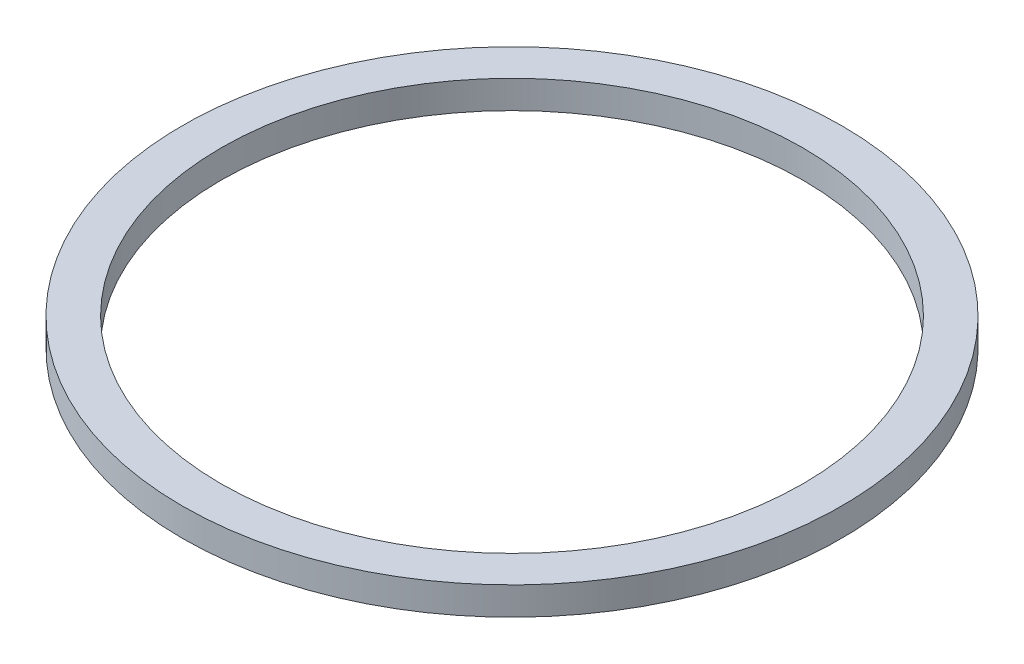
ISO-10303-21;
HEADER;
FILE_DESCRIPTION(('STEP AP214'),'2;1');
FILE_NAME('part.step','',(''),(''),'','','');
FILE_SCHEMA(('AUTOMOTIVE_DESIGN { 1 0 10303 214 1 1 1 1 }'));
ENDSEC;
DATA;
#1=APPLICATION_CONTEXT('core data for automotive mechanical design processes');
#2=APPLICATION_PROTOCOL_DEFINITION('international standard','automotive_design',2000,#1);
#3=PRODUCT_CONTEXT('',#1,'mechanical');
#4=PRODUCT('Part','Part','',(#3));
#5=PRODUCT_RELATED_PRODUCT_CATEGORY('part','',(#4));
#6=PRODUCT_DEFINITION_FORMATION('','',#4);
#7=PRODUCT_DEFINITION_CONTEXT('part definition',#1,'design');
#8=PRODUCT_DEFINITION('design','',#6,#7);
#9=PRODUCT_DEFINITION_SHAPE('','',#8);
#10=(LENGTH_UNIT() NAMED_UNIT(*) SI_UNIT(.MILLI.,.METRE.));
#11=(NAMED_UNIT(*) PLANE_ANGLE_UNIT() SI_UNIT($,.RADIAN.));
#12=(NAMED_UNIT(*) SI_UNIT($,.STERADIAN.) SOLID_ANGLE_UNIT());
#13=UNCERTAINTY_MEASURE_WITH_UNIT(LENGTH_MEASURE(1.E-05),#10,'distance_accuracy_value','');
#14=(GEOMETRIC_REPRESENTATION_CONTEXT(3) GLOBAL_UNCERTAINTY_ASSIGNED_CONTEXT((#13)) GLOBAL_UNIT_ASSIGNED_CONTEXT((#10,
#11,#12)) REPRESENTATION_CONTEXT('',''));
#15=CARTESIAN_POINT('',(0.,0.,0.));
#16=DIRECTION('',(0.,0.,1.));
#17=DIRECTION('',(1.,0.,0.));
#18=AXIS2_PLACEMENT_3D('',#15,#16,#17);
#19=CARTESIAN_POINT('',(0.,1.016,0.));
#20=DIRECTION('',(0.,1.,0.));
#21=DIRECTION('',(0.,0.,1.));
#22=AXIS2_PLACEMENT_3D('',#19,#20,#21);
#23=PLANE('',#22);
#24=CARTESIAN_POINT('',(0.,1.016,0.));
#25=DIRECTION('',(0.,1.,0.));
#26=DIRECTION('',(0.,0.,1.));
#27=AXIS2_PLACEMENT_3D('',#24,#25,#26);
#28=CIRCLE('',#27,11.95);
#29=CARTESIAN_POINT('',(0.,1.016,11.95));
#30=VERTEX_POINT('',#29);
#31=EDGE_CURVE('E10',#30,#30,#28,.T.);
#32=ORIENTED_EDGE('',*,*,#31,.T.);
#33=EDGE_LOOP('',(#32));
#34=FACE_BOUND('',#33,.T.);
#35=CARTESIAN_POINT('',(0.,1.016,0.));
#36=DIRECTION('',(0.,1.,0.));
#37=DIRECTION('',(0.,0.,1.));
#38=AXIS2_PLACEMENT_3D('',#35,#36,#37);
#39=CIRCLE('',#38,10.55);
#40=CARTESIAN_POINT('',(0.,1.016,10.55));
#41=VERTEX_POINT('',#40);
#42=EDGE_CURVE('E50',#41,#41,#39,.T.);
#43=ORIENTED_EDGE('',*,*,#42,.F.);
#44=EDGE_LOOP('',(#43));
#45=FACE_BOUND('',#44,.T.);
#46=ADVANCED_FACE('F37',(#34,#45),#23,.T.);
#47=CARTESIAN_POINT('',(0.,0.,0.));
#48=DIRECTION('',(0.,1.,0.));
#49=DIRECTION('',(0.,0.,1.));
#50=AXIS2_PLACEMENT_3D('',#47,#48,#49);
#51=PLANE('',#50);
#52=CARTESIAN_POINT('',(0.,0.,0.));
#53=DIRECTION('',(0.,1.,0.));
#54=DIRECTION('',(0.,0.,1.));
#55=AXIS2_PLACEMENT_3D('',#52,#53,#54);
#56=CIRCLE('',#55,11.95);
#57=CARTESIAN_POINT('',(0.,0.,11.95));
#58=VERTEX_POINT('',#57);
#59=EDGE_CURVE('E41',#58,#58,#56,.T.);
#60=ORIENTED_EDGE('',*,*,#59,.F.);
#61=EDGE_LOOP('',(#60));
#62=FACE_BOUND('',#61,.T.);
#63=CARTESIAN_POINT('',(0.,0.,0.));
#64=DIRECTION('',(0.,1.,0.));
#65=DIRECTION('',(0.,0.,1.));
#66=AXIS2_PLACEMENT_3D('',#63,#64,#65);
#67=CIRCLE('',#66,10.55);
#68=CARTESIAN_POINT('',(0.,0.,10.55));
#69=VERTEX_POINT('',#68);
#70=EDGE_CURVE('E52',#69,#69,#67,.T.);
#71=ORIENTED_EDGE('',*,*,#70,.T.);
#72=EDGE_LOOP('',(#71));
#73=FACE_BOUND('',#72,.T.);
#74=ADVANCED_FACE('F64',(#62,#73),#51,.F.);
#75=CARTESIAN_POINT('',(0.,1.016,0.));
#76=DIRECTION('',(0.,-1.,0.));
#77=DIRECTION('',(0.,0.,-1.));
#78=AXIS2_PLACEMENT_3D('',#75,#76,#77);
#79=CYLINDRICAL_SURFACE('',#78,11.95);
#80=ORIENTED_EDGE('',*,*,#31,.F.);
#81=EDGE_LOOP('',(#80));
#82=FACE_BOUND('',#81,.T.);
#83=ORIENTED_EDGE('',*,*,#59,.T.);
#84=EDGE_LOOP('',(#83));
#85=FACE_BOUND('',#84,.T.);
#86=ADVANCED_FACE('F39',(#82,#85),#79,.T.);
#87=CARTESIAN_POINT('',(0.,1.016,0.));
#88=DIRECTION('',(0.,-1.,0.));
#89=DIRECTION('',(0.,0.,-1.));
#90=AXIS2_PLACEMENT_3D('',#87,#88,#89);
#91=CYLINDRICAL_SURFACE('',#90,10.55);
#92=ORIENTED_EDGE('',*,*,#42,.T.);
#93=EDGE_LOOP('',(#92));
#94=FACE_BOUND('',#93,.T.);
#95=ORIENTED_EDGE('',*,*,#70,.F.);
#96=EDGE_LOOP('',(#95));
#97=FACE_BOUND('',#96,.T.);
#98=ADVANCED_FACE('F60',(#94,#97),#91,.F.);
#99=CLOSED_SHELL('',(#46,#74,#86,#98));
#100=MANIFOLD_SOLID_BREP('B2',#99);
#101=ADVANCED_BREP_SHAPE_REPRESENTATION('',(#18,#100),#14);
#102=SHAPE_DEFINITION_REPRESENTATION(#9,#101);
ENDSEC;
END-ISO-10303-21;
